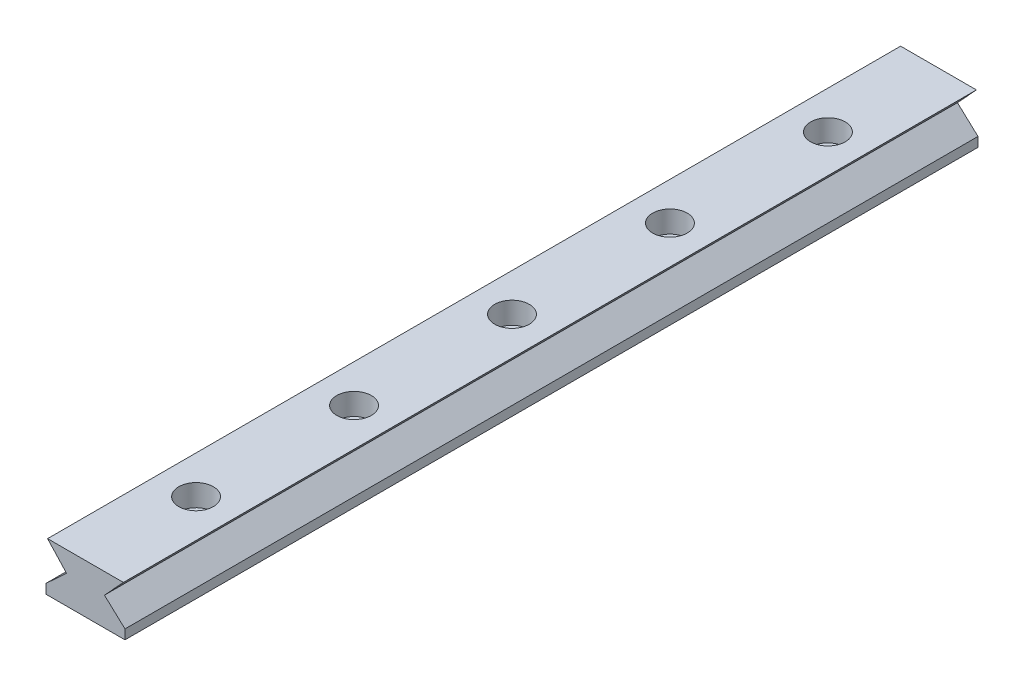
ISO-10303-21;
HEADER;
FILE_DESCRIPTION(('STEP AP214'),'2;1');
FILE_NAME('part.step','',(''),(''),'','','');
FILE_SCHEMA(('AUTOMOTIVE_DESIGN { 1 0 10303 214 1 1 1 1 }'));
ENDSEC;
DATA;
#1=APPLICATION_CONTEXT('core data for automotive mechanical design processes');
#2=APPLICATION_PROTOCOL_DEFINITION('international standard','automotive_design',2000,#1);
#3=PRODUCT_CONTEXT('',#1,'mechanical');
#4=PRODUCT('Part','Part','',(#3));
#5=PRODUCT_RELATED_PRODUCT_CATEGORY('part','',(#4));
#6=PRODUCT_DEFINITION_FORMATION('','',#4);
#7=PRODUCT_DEFINITION_CONTEXT('part definition',#1,'design');
#8=PRODUCT_DEFINITION('design','',#6,#7);
#9=PRODUCT_DEFINITION_SHAPE('','',#8);
#10=(LENGTH_UNIT() NAMED_UNIT(*) SI_UNIT(.MILLI.,.METRE.));
#11=(NAMED_UNIT(*) PLANE_ANGLE_UNIT() SI_UNIT($,.RADIAN.));
#12=(NAMED_UNIT(*) SI_UNIT($,.STERADIAN.) SOLID_ANGLE_UNIT());
#13=UNCERTAINTY_MEASURE_WITH_UNIT(LENGTH_MEASURE(1.E-05),#10,'distance_accuracy_value','');
#14=(GEOMETRIC_REPRESENTATION_CONTEXT(3) GLOBAL_UNCERTAINTY_ASSIGNED_CONTEXT((#13)) GLOBAL_UNIT_ASSIGNED_CONTEXT((#10,
#11,#12)) REPRESENTATION_CONTEXT('',''));
#15=CARTESIAN_POINT('',(0.,0.,0.));
#16=DIRECTION('',(0.,0.,1.));
#17=DIRECTION('',(1.,0.,0.));
#18=AXIS2_PLACEMENT_3D('',#15,#16,#17);
#19=CARTESIAN_POINT('',(6.35,0.,88.9));
#20=DIRECTION('',(0.,1.,0.));
#21=DIRECTION('',(-1.,0.,0.));
#22=AXIS2_PLACEMENT_3D('',#19,#20,#21);
#23=PLANE('',#22);
#24=CARTESIAN_POINT('',(0.,0.,-50.8));
#25=DIRECTION('',(0.,-1.,0.));
#26=DIRECTION('',(0.,0.,-1.));
#27=AXIS2_PLACEMENT_3D('',#24,#25,#26);
#28=CIRCLE('',#27,1.72719999999998);
#29=CARTESIAN_POINT('',(0.,0.,-52.5272));
#30=VERTEX_POINT('',#29);
#31=EDGE_CURVE('E158',#30,#30,#28,.T.);
#32=ORIENTED_EDGE('',*,*,#31,.F.);
#33=EDGE_LOOP('',(#32));
#34=FACE_BOUND('',#33,.T.);
#35=CARTESIAN_POINT('',(0.,0.,0.));
#36=DIRECTION('',(0.,-1.,0.));
#37=DIRECTION('',(0.,0.,-1.));
#38=AXIS2_PLACEMENT_3D('',#35,#36,#37);
#39=CIRCLE('',#38,1.72719999999998);
#40=CARTESIAN_POINT('',(0.,0.,-1.72719999999998));
#41=VERTEX_POINT('',#40);
#42=EDGE_CURVE('E182',#41,#41,#39,.T.);
#43=ORIENTED_EDGE('',*,*,#42,.F.);
#44=EDGE_LOOP('',(#43));
#45=FACE_BOUND('',#44,.T.);
#46=CARTESIAN_POINT('',(0.,0.,50.8));
#47=DIRECTION('',(0.,-1.,0.));
#48=DIRECTION('',(0.,0.,-1.));
#49=AXIS2_PLACEMENT_3D('',#46,#47,#48);
#50=CIRCLE('',#49,1.72719999999998);
#51=CARTESIAN_POINT('',(0.,0.,49.0728));
#52=VERTEX_POINT('',#51);
#53=EDGE_CURVE('E206',#52,#52,#50,.T.);
#54=ORIENTED_EDGE('',*,*,#53,.F.);
#55=EDGE_LOOP('',(#54));
#56=FACE_BOUND('',#55,.T.);
#57=DIRECTION('',(0.,0.,-1.));
#58=VECTOR('',#57,1.);
#59=CARTESIAN_POINT('',(6.35,0.,88.9));
#60=LINE('',#59,#58);
#61=CARTESIAN_POINT('',(6.35,0.,68.58));
#62=VERTEX_POINT('',#61);
#63=CARTESIAN_POINT('',(6.35,0.,-68.58));
#64=VERTEX_POINT('',#63);
#65=EDGE_CURVE('E111',#62,#64,#60,.T.);
#66=ORIENTED_EDGE('',*,*,#65,.F.);
#67=DIRECTION('',(-1.,0.,0.));
#68=VECTOR('',#67,1.);
#69=CARTESIAN_POINT('',(12.6209909173239,0.,68.58));
#70=LINE('',#69,#68);
#71=CARTESIAN_POINT('',(-6.35,0.,68.58));
#72=VERTEX_POINT('',#71);
#73=EDGE_CURVE('E96',#62,#72,#70,.T.);
#74=ORIENTED_EDGE('',*,*,#73,.T.);
#75=DIRECTION('',(0.,0.,-1.));
#76=VECTOR('',#75,1.);
#77=CARTESIAN_POINT('',(-6.35,0.,88.9));
#78=LINE('',#77,#76);
#79=CARTESIAN_POINT('',(-6.35,0.,-68.58));
#80=VERTEX_POINT('',#79);
#81=EDGE_CURVE('E119',#72,#80,#78,.T.);
#82=ORIENTED_EDGE('',*,*,#81,.T.);
#83=DIRECTION('',(1.,0.,0.));
#84=VECTOR('',#83,1.);
#85=CARTESIAN_POINT('',(-9.29852943612675,0.,-68.58));
#86=LINE('',#85,#84);
#87=EDGE_CURVE('E118',#80,#64,#86,.T.);
#88=ORIENTED_EDGE('',*,*,#87,.T.);
#89=EDGE_LOOP('',(#66,#74,#82,#88));
#90=FACE_BOUND('',#89,.T.);
#91=CARTESIAN_POINT('',(0.,0.,25.4));
#92=DIRECTION('',(0.,-1.,0.));
#93=DIRECTION('',(0.,0.,-1.));
#94=AXIS2_PLACEMENT_3D('',#91,#92,#93);
#95=CIRCLE('',#94,1.72719999999998);
#96=CARTESIAN_POINT('',(0.,0.,23.6728));
#97=VERTEX_POINT('',#96);
#98=EDGE_CURVE('E194',#97,#97,#95,.T.);
#99=ORIENTED_EDGE('',*,*,#98,.F.);
#100=EDGE_LOOP('',(#99));
#101=FACE_BOUND('',#100,.T.);
#102=CARTESIAN_POINT('',(0.,0.,-25.4));
#103=DIRECTION('',(0.,-1.,0.));
#104=DIRECTION('',(0.,0.,-1.));
#105=AXIS2_PLACEMENT_3D('',#102,#103,#104);
#106=CIRCLE('',#105,1.72719999999998);
#107=CARTESIAN_POINT('',(0.,0.,-27.1272));
#108=VERTEX_POINT('',#107);
#109=EDGE_CURVE('E170',#108,#108,#106,.T.);
#110=ORIENTED_EDGE('',*,*,#109,.F.);
#111=EDGE_LOOP('',(#110));
#112=FACE_BOUND('',#111,.T.);
#113=ADVANCED_FACE('F32',(#34,#45,#56,#90,#101,#112),#23,.F.);
#114=CARTESIAN_POINT('',(-6.096,7.874,88.9));
#115=DIRECTION('',(0.,-1.,0.));
#116=DIRECTION('',(0.,0.,-1.));
#117=AXIS2_PLACEMENT_3D('',#114,#115,#116);
#118=PLANE('',#117);
#119=CARTESIAN_POINT('',(0.,7.874,-50.8));
#120=DIRECTION('',(0.,-1.,0.));
#121=DIRECTION('',(0.,0.,-1.));
#122=AXIS2_PLACEMENT_3D('',#119,#120,#121);
#123=CIRCLE('',#122,2.78129999999999);
#124=CARTESIAN_POINT('',(0.,7.874,-53.5813));
#125=VERTEX_POINT('',#124);
#126=EDGE_CURVE('E167',#125,#125,#123,.T.);
#127=ORIENTED_EDGE('',*,*,#126,.T.);
#128=EDGE_LOOP('',(#127));
#129=FACE_BOUND('',#128,.T.);
#130=CARTESIAN_POINT('',(0.,7.874,0.));
#131=DIRECTION('',(0.,-1.,0.));
#132=DIRECTION('',(0.,0.,-1.));
#133=AXIS2_PLACEMENT_3D('',#130,#131,#132);
#134=CIRCLE('',#133,2.78129999999999);
#135=CARTESIAN_POINT('',(0.,7.874,-2.78129999999999));
#136=VERTEX_POINT('',#135);
#137=EDGE_CURVE('E191',#136,#136,#134,.T.);
#138=ORIENTED_EDGE('',*,*,#137,.T.);
#139=EDGE_LOOP('',(#138));
#140=FACE_BOUND('',#139,.T.);
#141=CARTESIAN_POINT('',(0.,7.874,50.8));
#142=DIRECTION('',(0.,-1.,0.));
#143=DIRECTION('',(0.,0.,-1.));
#144=AXIS2_PLACEMENT_3D('',#141,#142,#143);
#145=CIRCLE('',#144,2.78129999999999);
#146=CARTESIAN_POINT('',(0.,7.874,48.0187));
#147=VERTEX_POINT('',#146);
#148=EDGE_CURVE('E215',#147,#147,#145,.T.);
#149=ORIENTED_EDGE('',*,*,#148,.T.);
#150=EDGE_LOOP('',(#149));
#151=FACE_BOUND('',#150,.T.);
#152=DIRECTION('',(0.,0.,-1.));
#153=VECTOR('',#152,1.);
#154=CARTESIAN_POINT('',(-6.096,7.874,88.9));
#155=LINE('',#154,#153);
#156=CARTESIAN_POINT('',(-6.096,7.874,68.58));
#157=VERTEX_POINT('',#156);
#158=CARTESIAN_POINT('',(-6.096,7.874,-68.58));
#159=VERTEX_POINT('',#158);
#160=EDGE_CURVE('E218',#157,#159,#155,.T.);
#161=ORIENTED_EDGE('',*,*,#160,.F.);
#162=DIRECTION('',(-1.,0.,0.));
#163=VECTOR('',#162,1.);
#164=CARTESIAN_POINT('',(12.6209909173239,7.874,68.58));
#165=LINE('',#164,#163);
#166=CARTESIAN_POINT('',(6.096,7.874,68.58));
#167=VERTEX_POINT('',#166);
#168=EDGE_CURVE('E105',#167,#157,#165,.T.);
#169=ORIENTED_EDGE('',*,*,#168,.F.);
#170=DIRECTION('',(0.,0.,-1.));
#171=VECTOR('',#170,1.);
#172=CARTESIAN_POINT('',(6.096,7.874,88.9));
#173=LINE('',#172,#171);
#174=CARTESIAN_POINT('',(6.096,7.874,-68.58));
#175=VERTEX_POINT('',#174);
#176=EDGE_CURVE('E54',#167,#175,#173,.T.);
#177=ORIENTED_EDGE('',*,*,#176,.T.);
#178=DIRECTION('',(1.,0.,0.));
#179=VECTOR('',#178,1.);
#180=CARTESIAN_POINT('',(-9.29852943612675,7.874,-68.58));
#181=LINE('',#180,#179);
#182=EDGE_CURVE('E140',#159,#175,#181,.T.);
#183=ORIENTED_EDGE('',*,*,#182,.F.);
#184=EDGE_LOOP('',(#161,#169,#177,#183));
#185=FACE_BOUND('',#184,.T.);
#186=CARTESIAN_POINT('',(0.,7.874,25.4));
#187=DIRECTION('',(0.,-1.,0.));
#188=DIRECTION('',(0.,0.,-1.));
#189=AXIS2_PLACEMENT_3D('',#186,#187,#188);
#190=CIRCLE('',#189,2.78129999999999);
#191=CARTESIAN_POINT('',(0.,7.874,22.6187));
#192=VERTEX_POINT('',#191);
#193=EDGE_CURVE('E203',#192,#192,#190,.T.);
#194=ORIENTED_EDGE('',*,*,#193,.T.);
#195=EDGE_LOOP('',(#194));
#196=FACE_BOUND('',#195,.T.);
#197=CARTESIAN_POINT('',(0.,7.874,-25.4));
#198=DIRECTION('',(0.,-1.,0.));
#199=DIRECTION('',(0.,0.,-1.));
#200=AXIS2_PLACEMENT_3D('',#197,#198,#199);
#201=CIRCLE('',#200,2.78129999999999);
#202=CARTESIAN_POINT('',(0.,7.874,-28.1813));
#203=VERTEX_POINT('',#202);
#204=EDGE_CURVE('E179',#203,#203,#201,.T.);
#205=ORIENTED_EDGE('',*,*,#204,.T.);
#206=EDGE_LOOP('',(#205));
#207=FACE_BOUND('',#206,.T.);
#208=ADVANCED_FACE('F227',(#129,#140,#151,#185,#196,#207),#118,.F.);
#209=CARTESIAN_POINT('',(-3.048,4.572,88.9));
#210=DIRECTION('',(0.734803444627488,0.678280102733066,0.));
#211=DIRECTION('',(-0.678280102733066,0.734803444627488,0.));
#212=AXIS2_PLACEMENT_3D('',#209,#210,#211);
#213=PLANE('',#212);
#214=DIRECTION('',(0.,0.,-1.));
#215=VECTOR('',#214,1.);
#216=CARTESIAN_POINT('',(-3.048,4.572,88.9));
#217=LINE('',#216,#215);
#218=CARTESIAN_POINT('',(-3.048,4.572,68.58));
#219=VERTEX_POINT('',#218);
#220=CARTESIAN_POINT('',(-3.048,4.572,-68.58));
#221=VERTEX_POINT('',#220);
#222=EDGE_CURVE('E128',#219,#221,#217,.T.);
#223=ORIENTED_EDGE('',*,*,#222,.F.);
#224=DIRECTION('',(-0.678280102733066,0.734803444627488,0.));
#225=VECTOR('',#224,1.);
#226=CARTESIAN_POINT('',(-3.048,4.572,68.58));
#227=LINE('',#226,#225);
#228=EDGE_CURVE('E224',#219,#157,#227,.T.);
#229=ORIENTED_EDGE('',*,*,#228,.T.);
#230=ORIENTED_EDGE('',*,*,#160,.T.);
#231=DIRECTION('',(0.678280102733066,-0.734803444627488,0.));
#232=VECTOR('',#231,1.);
#233=CARTESIAN_POINT('',(-3.048,4.572,-68.58));
#234=LINE('',#233,#232);
#235=EDGE_CURVE('E155',#159,#221,#234,.T.);
#236=ORIENTED_EDGE('',*,*,#235,.T.);
#237=EDGE_LOOP('',(#223,#229,#230,#236));
#238=FACE_BOUND('',#237,.T.);
#239=ADVANCED_FACE('F34',(#238),#213,.F.);
#240=CARTESIAN_POINT('',(-6.35,1.524,88.9));
#241=DIRECTION('',(0.678280102733066,-0.734803444627488,0.));
#242=DIRECTION('',(0.734803444627488,0.678280102733066,0.));
#243=AXIS2_PLACEMENT_3D('',#240,#241,#242);
#244=PLANE('',#243);
#245=DIRECTION('',(0.,0.,-1.));
#246=VECTOR('',#245,1.);
#247=CARTESIAN_POINT('',(-6.35,1.524,88.9));
#248=LINE('',#247,#246);
#249=CARTESIAN_POINT('',(-6.35,1.524,68.58));
#250=VERTEX_POINT('',#249);
#251=CARTESIAN_POINT('',(-6.35,1.524,-68.58));
#252=VERTEX_POINT('',#251);
#253=EDGE_CURVE('E121',#250,#252,#248,.T.);
#254=ORIENTED_EDGE('',*,*,#253,.F.);
#255=DIRECTION('',(0.734803444627488,0.678280102733066,0.));
#256=VECTOR('',#255,1.);
#257=CARTESIAN_POINT('',(-6.35,1.524,68.58));
#258=LINE('',#257,#256);
#259=EDGE_CURVE('E229',#250,#219,#258,.T.);
#260=ORIENTED_EDGE('',*,*,#259,.T.);
#261=ORIENTED_EDGE('',*,*,#222,.T.);
#262=DIRECTION('',(-0.734803444627488,-0.678280102733066,0.));
#263=VECTOR('',#262,1.);
#264=CARTESIAN_POINT('',(-6.35,1.524,-68.58));
#265=LINE('',#264,#263);
#266=EDGE_CURVE('E152',#221,#252,#265,.T.);
#267=ORIENTED_EDGE('',*,*,#266,.T.);
#268=EDGE_LOOP('',(#254,#260,#261,#267));
#269=FACE_BOUND('',#268,.T.);
#270=ADVANCED_FACE('F238',(#269),#244,.F.);
#271=CARTESIAN_POINT('',(-6.35,0.,88.9));
#272=DIRECTION('',(1.,0.,0.));
#273=DIRECTION('',(0.,1.,0.));
#274=AXIS2_PLACEMENT_3D('',#271,#272,#273);
#275=PLANE('',#274);
#276=ORIENTED_EDGE('',*,*,#81,.F.);
#277=DIRECTION('',(0.,1.,0.));
#278=VECTOR('',#277,1.);
#279=CARTESIAN_POINT('',(-6.35,0.,68.58));
#280=LINE('',#279,#278);
#281=EDGE_CURVE('E101',#72,#250,#280,.T.);
#282=ORIENTED_EDGE('',*,*,#281,.T.);
#283=ORIENTED_EDGE('',*,*,#253,.T.);
#284=DIRECTION('',(0.,-1.,0.));
#285=VECTOR('',#284,1.);
#286=CARTESIAN_POINT('',(-6.35,0.,-68.58));
#287=LINE('',#286,#285);
#288=EDGE_CURVE('E145',#252,#80,#287,.T.);
#289=ORIENTED_EDGE('',*,*,#288,.T.);
#290=EDGE_LOOP('',(#276,#282,#283,#289));
#291=FACE_BOUND('',#290,.T.);
#292=ADVANCED_FACE('F240',(#291),#275,.F.);
#293=CARTESIAN_POINT('',(6.35,1.524,88.9));
#294=DIRECTION('',(-1.,0.,0.));
#295=DIRECTION('',(0.,0.,1.));
#296=AXIS2_PLACEMENT_3D('',#293,#294,#295);
#297=PLANE('',#296);
#298=DIRECTION('',(0.,0.,-1.));
#299=VECTOR('',#298,1.);
#300=CARTESIAN_POINT('',(6.35,1.524,88.9));
#301=LINE('',#300,#299);
#302=CARTESIAN_POINT('',(6.35,1.524,68.58));
#303=VERTEX_POINT('',#302);
#304=CARTESIAN_POINT('',(6.35,1.524,-68.58));
#305=VERTEX_POINT('',#304);
#306=EDGE_CURVE('E113',#303,#305,#301,.T.);
#307=ORIENTED_EDGE('',*,*,#306,.F.);
#308=DIRECTION('',(0.,-1.,0.));
#309=VECTOR('',#308,1.);
#310=CARTESIAN_POINT('',(6.35,1.524,68.58));
#311=LINE('',#310,#309);
#312=EDGE_CURVE('E99',#303,#62,#311,.T.);
#313=ORIENTED_EDGE('',*,*,#312,.T.);
#314=ORIENTED_EDGE('',*,*,#65,.T.);
#315=DIRECTION('',(0.,1.,0.));
#316=VECTOR('',#315,1.);
#317=CARTESIAN_POINT('',(6.35,1.524,-68.58));
#318=LINE('',#317,#316);
#319=EDGE_CURVE('E143',#64,#305,#318,.T.);
#320=ORIENTED_EDGE('',*,*,#319,.T.);
#321=EDGE_LOOP('',(#307,#313,#314,#320));
#322=FACE_BOUND('',#321,.T.);
#323=ADVANCED_FACE('F109',(#322),#297,.F.);
#324=CARTESIAN_POINT('',(3.048,4.572,88.9));
#325=DIRECTION('',(-0.678280102733066,-0.734803444627488,0.));
#326=DIRECTION('',(0.734803444627488,-0.678280102733066,0.));
#327=AXIS2_PLACEMENT_3D('',#324,#325,#326);
#328=PLANE('',#327);
#329=DIRECTION('',(0.,0.,-1.));
#330=VECTOR('',#329,1.);
#331=CARTESIAN_POINT('',(3.048,4.572,88.9));
#332=LINE('',#331,#330);
#333=CARTESIAN_POINT('',(3.048,4.572,68.58));
#334=VERTEX_POINT('',#333);
#335=CARTESIAN_POINT('',(3.048,4.572,-68.58));
#336=VERTEX_POINT('',#335);
#337=EDGE_CURVE('E123',#334,#336,#332,.T.);
#338=ORIENTED_EDGE('',*,*,#337,.F.);
#339=DIRECTION('',(0.734803444627488,-0.678280102733066,0.));
#340=VECTOR('',#339,1.);
#341=CARTESIAN_POINT('',(3.048,4.572,68.58));
#342=LINE('',#341,#340);
#343=EDGE_CURVE('E47',#334,#303,#342,.T.);
#344=ORIENTED_EDGE('',*,*,#343,.T.);
#345=ORIENTED_EDGE('',*,*,#306,.T.);
#346=DIRECTION('',(-0.734803444627488,0.678280102733066,0.));
#347=VECTOR('',#346,1.);
#348=CARTESIAN_POINT('',(3.048,4.572,-68.58));
#349=LINE('',#348,#347);
#350=EDGE_CURVE('E138',#305,#336,#349,.T.);
#351=ORIENTED_EDGE('',*,*,#350,.T.);
#352=EDGE_LOOP('',(#338,#344,#345,#351));
#353=FACE_BOUND('',#352,.T.);
#354=ADVANCED_FACE('F142',(#353),#328,.F.);
#355=CARTESIAN_POINT('',(6.096,7.874,88.9));
#356=DIRECTION('',(-0.734803444627488,0.678280102733066,0.));
#357=DIRECTION('',(-0.678280102733066,-0.734803444627488,0.));
#358=AXIS2_PLACEMENT_3D('',#355,#356,#357);
#359=PLANE('',#358);
#360=ORIENTED_EDGE('',*,*,#176,.F.);
#361=DIRECTION('',(-0.678280102733066,-0.734803444627488,0.));
#362=VECTOR('',#361,1.);
#363=CARTESIAN_POINT('',(6.096,7.874,68.58));
#364=LINE('',#363,#362);
#365=EDGE_CURVE('E11',#167,#334,#364,.T.);
#366=ORIENTED_EDGE('',*,*,#365,.T.);
#367=ORIENTED_EDGE('',*,*,#337,.T.);
#368=DIRECTION('',(0.678280102733066,0.734803444627488,0.));
#369=VECTOR('',#368,1.);
#370=CARTESIAN_POINT('',(6.096,7.874,-68.58));
#371=LINE('',#370,#369);
#372=EDGE_CURVE('E40',#336,#175,#371,.T.);
#373=ORIENTED_EDGE('',*,*,#372,.T.);
#374=EDGE_LOOP('',(#360,#366,#367,#373));
#375=FACE_BOUND('',#374,.T.);
#376=ADVANCED_FACE('F132',(#375),#359,.F.);
#377=CARTESIAN_POINT('',(0.,0.,50.8));
#378=DIRECTION('',(0.,-1.,0.));
#379=DIRECTION('',(0.,0.,-1.));
#380=AXIS2_PLACEMENT_3D('',#377,#378,#379);
#381=CYLINDRICAL_SURFACE('',#380,2.78129999999999);
#382=CARTESIAN_POINT('',(0.,4.3688,50.8));
#383=DIRECTION('',(0.,-1.,0.));
#384=DIRECTION('',(0.,0.,-1.));
#385=AXIS2_PLACEMENT_3D('',#382,#383,#384);
#386=CIRCLE('',#385,2.78129999999999);
#387=CARTESIAN_POINT('',(0.,4.3688,48.0187));
#388=VERTEX_POINT('',#387);
#389=EDGE_CURVE('E212',#388,#388,#386,.T.);
#390=ORIENTED_EDGE('',*,*,#389,.T.);
#391=EDGE_LOOP('',(#390));
#392=FACE_BOUND('',#391,.T.);
#393=ORIENTED_EDGE('',*,*,#148,.F.);
#394=EDGE_LOOP('',(#393));
#395=FACE_BOUND('',#394,.T.);
#396=ADVANCED_FACE('F262',(#392,#395),#381,.F.);
#397=CARTESIAN_POINT('',(0.,4.3688,48.0187));
#398=DIRECTION('',(0.,1.,0.));
#399=DIRECTION('',(0.,0.,1.));
#400=AXIS2_PLACEMENT_3D('',#397,#398,#399);
#401=PLANE('',#400);
#402=CARTESIAN_POINT('',(0.,4.3688,50.8));
#403=DIRECTION('',(0.,-1.,0.));
#404=DIRECTION('',(0.,0.,-1.));
#405=AXIS2_PLACEMENT_3D('',#402,#403,#404);
#406=CIRCLE('',#405,1.72719999999998);
#407=CARTESIAN_POINT('',(0.,4.3688,49.0728));
#408=VERTEX_POINT('',#407);
#409=EDGE_CURVE('E209',#408,#408,#406,.T.);
#410=ORIENTED_EDGE('',*,*,#409,.T.);
#411=EDGE_LOOP('',(#410));
#412=FACE_BOUND('',#411,.T.);
#413=ORIENTED_EDGE('',*,*,#389,.F.);
#414=EDGE_LOOP('',(#413));
#415=FACE_BOUND('',#414,.T.);
#416=ADVANCED_FACE('F266',(#412,#415),#401,.T.);
#417=CARTESIAN_POINT('',(0.,0.,50.8));
#418=DIRECTION('',(0.,-1.,0.));
#419=DIRECTION('',(0.,0.,-1.));
#420=AXIS2_PLACEMENT_3D('',#417,#418,#419);
#421=CYLINDRICAL_SURFACE('',#420,1.72719999999998);
#422=ORIENTED_EDGE('',*,*,#53,.T.);
#423=EDGE_LOOP('',(#422));
#424=FACE_BOUND('',#423,.T.);
#425=ORIENTED_EDGE('',*,*,#409,.F.);
#426=EDGE_LOOP('',(#425));
#427=FACE_BOUND('',#426,.T.);
#428=ADVANCED_FACE('F270',(#424,#427),#421,.F.);
#429=CARTESIAN_POINT('',(0.,0.,25.4));
#430=DIRECTION('',(0.,-1.,0.));
#431=DIRECTION('',(0.,0.,-1.));
#432=AXIS2_PLACEMENT_3D('',#429,#430,#431);
#433=CYLINDRICAL_SURFACE('',#432,2.78129999999999);
#434=CARTESIAN_POINT('',(0.,4.3688,25.4));
#435=DIRECTION('',(0.,-1.,0.));
#436=DIRECTION('',(0.,0.,-1.));
#437=AXIS2_PLACEMENT_3D('',#434,#435,#436);
#438=CIRCLE('',#437,2.78129999999999);
#439=CARTESIAN_POINT('',(0.,4.3688,22.6187));
#440=VERTEX_POINT('',#439);
#441=EDGE_CURVE('E200',#440,#440,#438,.T.);
#442=ORIENTED_EDGE('',*,*,#441,.T.);
#443=EDGE_LOOP('',(#442));
#444=FACE_BOUND('',#443,.T.);
#445=ORIENTED_EDGE('',*,*,#193,.F.);
#446=EDGE_LOOP('',(#445));
#447=FACE_BOUND('',#446,.T.);
#448=ADVANCED_FACE('F274',(#444,#447),#433,.F.);
#449=CARTESIAN_POINT('',(0.,4.3688,22.6187));
#450=DIRECTION('',(0.,1.,0.));
#451=DIRECTION('',(0.,0.,1.));
#452=AXIS2_PLACEMENT_3D('',#449,#450,#451);
#453=PLANE('',#452);
#454=CARTESIAN_POINT('',(0.,4.3688,25.4));
#455=DIRECTION('',(0.,-1.,0.));
#456=DIRECTION('',(0.,0.,-1.));
#457=AXIS2_PLACEMENT_3D('',#454,#455,#456);
#458=CIRCLE('',#457,1.72719999999998);
#459=CARTESIAN_POINT('',(0.,4.3688,23.6728));
#460=VERTEX_POINT('',#459);
#461=EDGE_CURVE('E197',#460,#460,#458,.T.);
#462=ORIENTED_EDGE('',*,*,#461,.T.);
#463=EDGE_LOOP('',(#462));
#464=FACE_BOUND('',#463,.T.);
#465=ORIENTED_EDGE('',*,*,#441,.F.);
#466=EDGE_LOOP('',(#465));
#467=FACE_BOUND('',#466,.T.);
#468=ADVANCED_FACE('F278',(#464,#467),#453,.T.);
#469=CARTESIAN_POINT('',(0.,0.,25.4));
#470=DIRECTION('',(0.,-1.,0.));
#471=DIRECTION('',(0.,0.,-1.));
#472=AXIS2_PLACEMENT_3D('',#469,#470,#471);
#473=CYLINDRICAL_SURFACE('',#472,1.72719999999998);
#474=ORIENTED_EDGE('',*,*,#98,.T.);
#475=EDGE_LOOP('',(#474));
#476=FACE_BOUND('',#475,.T.);
#477=ORIENTED_EDGE('',*,*,#461,.F.);
#478=EDGE_LOOP('',(#477));
#479=FACE_BOUND('',#478,.T.);
#480=ADVANCED_FACE('F282',(#476,#479),#473,.F.);
#481=CARTESIAN_POINT('',(0.,0.,0.));
#482=DIRECTION('',(0.,-1.,0.));
#483=DIRECTION('',(0.,0.,-1.));
#484=AXIS2_PLACEMENT_3D('',#481,#482,#483);
#485=CYLINDRICAL_SURFACE('',#484,2.78129999999999);
#486=CARTESIAN_POINT('',(0.,4.3688,0.));
#487=DIRECTION('',(0.,-1.,0.));
#488=DIRECTION('',(0.,0.,-1.));
#489=AXIS2_PLACEMENT_3D('',#486,#487,#488);
#490=CIRCLE('',#489,2.78129999999999);
#491=CARTESIAN_POINT('',(0.,4.3688,-2.78129999999999));
#492=VERTEX_POINT('',#491);
#493=EDGE_CURVE('E188',#492,#492,#490,.T.);
#494=ORIENTED_EDGE('',*,*,#493,.T.);
#495=EDGE_LOOP('',(#494));
#496=FACE_BOUND('',#495,.T.);
#497=ORIENTED_EDGE('',*,*,#137,.F.);
#498=EDGE_LOOP('',(#497));
#499=FACE_BOUND('',#498,.T.);
#500=ADVANCED_FACE('F286',(#496,#499),#485,.F.);
#501=CARTESIAN_POINT('',(0.,4.3688,-2.78129999999999));
#502=DIRECTION('',(0.,1.,0.));
#503=DIRECTION('',(0.,0.,1.));
#504=AXIS2_PLACEMENT_3D('',#501,#502,#503);
#505=PLANE('',#504);
#506=CARTESIAN_POINT('',(0.,4.3688,0.));
#507=DIRECTION('',(0.,-1.,0.));
#508=DIRECTION('',(0.,0.,-1.));
#509=AXIS2_PLACEMENT_3D('',#506,#507,#508);
#510=CIRCLE('',#509,1.72719999999998);
#511=CARTESIAN_POINT('',(0.,4.3688,-1.72719999999998));
#512=VERTEX_POINT('',#511);
#513=EDGE_CURVE('E185',#512,#512,#510,.T.);
#514=ORIENTED_EDGE('',*,*,#513,.T.);
#515=EDGE_LOOP('',(#514));
#516=FACE_BOUND('',#515,.T.);
#517=ORIENTED_EDGE('',*,*,#493,.F.);
#518=EDGE_LOOP('',(#517));
#519=FACE_BOUND('',#518,.T.);
#520=ADVANCED_FACE('F290',(#516,#519),#505,.T.);
#521=CARTESIAN_POINT('',(0.,0.,0.));
#522=DIRECTION('',(0.,-1.,0.));
#523=DIRECTION('',(0.,0.,-1.));
#524=AXIS2_PLACEMENT_3D('',#521,#522,#523);
#525=CYLINDRICAL_SURFACE('',#524,1.72719999999998);
#526=ORIENTED_EDGE('',*,*,#42,.T.);
#527=EDGE_LOOP('',(#526));
#528=FACE_BOUND('',#527,.T.);
#529=ORIENTED_EDGE('',*,*,#513,.F.);
#530=EDGE_LOOP('',(#529));
#531=FACE_BOUND('',#530,.T.);
#532=ADVANCED_FACE('F294',(#528,#531),#525,.F.);
#533=CARTESIAN_POINT('',(0.,0.,-25.4));
#534=DIRECTION('',(0.,-1.,0.));
#535=DIRECTION('',(0.,0.,-1.));
#536=AXIS2_PLACEMENT_3D('',#533,#534,#535);
#537=CYLINDRICAL_SURFACE('',#536,2.78129999999999);
#538=CARTESIAN_POINT('',(0.,4.3688,-25.4));
#539=DIRECTION('',(0.,-1.,0.));
#540=DIRECTION('',(0.,0.,-1.));
#541=AXIS2_PLACEMENT_3D('',#538,#539,#540);
#542=CIRCLE('',#541,2.78129999999999);
#543=CARTESIAN_POINT('',(0.,4.3688,-28.1813));
#544=VERTEX_POINT('',#543);
#545=EDGE_CURVE('E176',#544,#544,#542,.T.);
#546=ORIENTED_EDGE('',*,*,#545,.T.);
#547=EDGE_LOOP('',(#546));
#548=FACE_BOUND('',#547,.T.);
#549=ORIENTED_EDGE('',*,*,#204,.F.);
#550=EDGE_LOOP('',(#549));
#551=FACE_BOUND('',#550,.T.);
#552=ADVANCED_FACE('F298',(#548,#551),#537,.F.);
#553=CARTESIAN_POINT('',(0.,4.3688,-28.1813));
#554=DIRECTION('',(0.,1.,0.));
#555=DIRECTION('',(0.,0.,1.));
#556=AXIS2_PLACEMENT_3D('',#553,#554,#555);
#557=PLANE('',#556);
#558=CARTESIAN_POINT('',(0.,4.3688,-25.4));
#559=DIRECTION('',(0.,-1.,0.));
#560=DIRECTION('',(0.,0.,-1.));
#561=AXIS2_PLACEMENT_3D('',#558,#559,#560);
#562=CIRCLE('',#561,1.72719999999998);
#563=CARTESIAN_POINT('',(0.,4.3688,-27.1272));
#564=VERTEX_POINT('',#563);
#565=EDGE_CURVE('E173',#564,#564,#562,.T.);
#566=ORIENTED_EDGE('',*,*,#565,.T.);
#567=EDGE_LOOP('',(#566));
#568=FACE_BOUND('',#567,.T.);
#569=ORIENTED_EDGE('',*,*,#545,.F.);
#570=EDGE_LOOP('',(#569));
#571=FACE_BOUND('',#570,.T.);
#572=ADVANCED_FACE('F302',(#568,#571),#557,.T.);
#573=CARTESIAN_POINT('',(0.,0.,-25.4));
#574=DIRECTION('',(0.,-1.,0.));
#575=DIRECTION('',(0.,0.,-1.));
#576=AXIS2_PLACEMENT_3D('',#573,#574,#575);
#577=CYLINDRICAL_SURFACE('',#576,1.72719999999998);
#578=ORIENTED_EDGE('',*,*,#109,.T.);
#579=EDGE_LOOP('',(#578));
#580=FACE_BOUND('',#579,.T.);
#581=ORIENTED_EDGE('',*,*,#565,.F.);
#582=EDGE_LOOP('',(#581));
#583=FACE_BOUND('',#582,.T.);
#584=ADVANCED_FACE('F306',(#580,#583),#577,.F.);
#585=CARTESIAN_POINT('',(0.,0.,-50.8));
#586=DIRECTION('',(0.,-1.,0.));
#587=DIRECTION('',(0.,0.,-1.));
#588=AXIS2_PLACEMENT_3D('',#585,#586,#587);
#589=CYLINDRICAL_SURFACE('',#588,2.78129999999999);
#590=CARTESIAN_POINT('',(0.,4.3688,-50.8));
#591=DIRECTION('',(0.,-1.,0.));
#592=DIRECTION('',(0.,0.,-1.));
#593=AXIS2_PLACEMENT_3D('',#590,#591,#592);
#594=CIRCLE('',#593,2.78129999999999);
#595=CARTESIAN_POINT('',(0.,4.3688,-53.5813));
#596=VERTEX_POINT('',#595);
#597=EDGE_CURVE('E164',#596,#596,#594,.T.);
#598=ORIENTED_EDGE('',*,*,#597,.T.);
#599=EDGE_LOOP('',(#598));
#600=FACE_BOUND('',#599,.T.);
#601=ORIENTED_EDGE('',*,*,#126,.F.);
#602=EDGE_LOOP('',(#601));
#603=FACE_BOUND('',#602,.T.);
#604=ADVANCED_FACE('F310',(#600,#603),#589,.F.);
#605=CARTESIAN_POINT('',(0.,4.3688,-53.5813));
#606=DIRECTION('',(0.,1.,0.));
#607=DIRECTION('',(0.,0.,1.));
#608=AXIS2_PLACEMENT_3D('',#605,#606,#607);
#609=PLANE('',#608);
#610=CARTESIAN_POINT('',(0.,4.3688,-50.8));
#611=DIRECTION('',(0.,-1.,0.));
#612=DIRECTION('',(0.,0.,-1.));
#613=AXIS2_PLACEMENT_3D('',#610,#611,#612);
#614=CIRCLE('',#613,1.72719999999998);
#615=CARTESIAN_POINT('',(0.,4.3688,-52.5272));
#616=VERTEX_POINT('',#615);
#617=EDGE_CURVE('E161',#616,#616,#614,.T.);
#618=ORIENTED_EDGE('',*,*,#617,.T.);
#619=EDGE_LOOP('',(#618));
#620=FACE_BOUND('',#619,.T.);
#621=ORIENTED_EDGE('',*,*,#597,.F.);
#622=EDGE_LOOP('',(#621));
#623=FACE_BOUND('',#622,.T.);
#624=ADVANCED_FACE('F314',(#620,#623),#609,.T.);
#625=CARTESIAN_POINT('',(0.,0.,-50.8));
#626=DIRECTION('',(0.,-1.,0.));
#627=DIRECTION('',(0.,0.,-1.));
#628=AXIS2_PLACEMENT_3D('',#625,#626,#627);
#629=CYLINDRICAL_SURFACE('',#628,1.72719999999998);
#630=ORIENTED_EDGE('',*,*,#31,.T.);
#631=EDGE_LOOP('',(#630));
#632=FACE_BOUND('',#631,.T.);
#633=ORIENTED_EDGE('',*,*,#617,.F.);
#634=EDGE_LOOP('',(#633));
#635=FACE_BOUND('',#634,.T.);
#636=ADVANCED_FACE('F318',(#632,#635),#629,.F.);
#637=CARTESIAN_POINT('',(-9.29852943612675,0.,-68.58));
#638=DIRECTION('',(0.,0.,1.));
#639=DIRECTION('',(1.,0.,0.));
#640=AXIS2_PLACEMENT_3D('',#637,#638,#639);
#641=PLANE('',#640);
#642=ORIENTED_EDGE('',*,*,#182,.T.);
#643=ORIENTED_EDGE('',*,*,#372,.F.);
#644=ORIENTED_EDGE('',*,*,#350,.F.);
#645=ORIENTED_EDGE('',*,*,#319,.F.);
#646=ORIENTED_EDGE('',*,*,#87,.F.);
#647=ORIENTED_EDGE('',*,*,#288,.F.);
#648=ORIENTED_EDGE('',*,*,#266,.F.);
#649=ORIENTED_EDGE('',*,*,#235,.F.);
#650=EDGE_LOOP('',(#642,#643,#644,#645,#646,#647,#648,#649));
#651=FACE_BOUND('',#650,.T.);
#652=ADVANCED_FACE('F137',(#651),#641,.F.);
#653=CARTESIAN_POINT('',(12.6209909173239,0.,68.58));
#654=DIRECTION('',(0.,0.,-1.));
#655=DIRECTION('',(-1.,0.,0.));
#656=AXIS2_PLACEMENT_3D('',#653,#654,#655);
#657=PLANE('',#656);
#658=ORIENTED_EDGE('',*,*,#259,.F.);
#659=ORIENTED_EDGE('',*,*,#281,.F.);
#660=ORIENTED_EDGE('',*,*,#73,.F.);
#661=ORIENTED_EDGE('',*,*,#312,.F.);
#662=ORIENTED_EDGE('',*,*,#343,.F.);
#663=ORIENTED_EDGE('',*,*,#365,.F.);
#664=ORIENTED_EDGE('',*,*,#168,.T.);
#665=ORIENTED_EDGE('',*,*,#228,.F.);
#666=EDGE_LOOP('',(#658,#659,#660,#661,#662,#663,#664,#665));
#667=FACE_BOUND('',#666,.T.);
#668=ADVANCED_FACE('F98',(#667),#657,.F.);
#669=CLOSED_SHELL('',(#113,#208,#239,#270,#292,#323,#354,#376,#396,#416,#428,#448,#468,#480,
#500,#520,#532,#552,#572,#584,#604,#624,#636,#652,#668));
#670=MANIFOLD_SOLID_BREP('B2',#669);
#671=ADVANCED_BREP_SHAPE_REPRESENTATION('',(#18,#670),#14);
#672=SHAPE_DEFINITION_REPRESENTATION(#9,#671);
ENDSEC;
END-ISO-10303-21;
